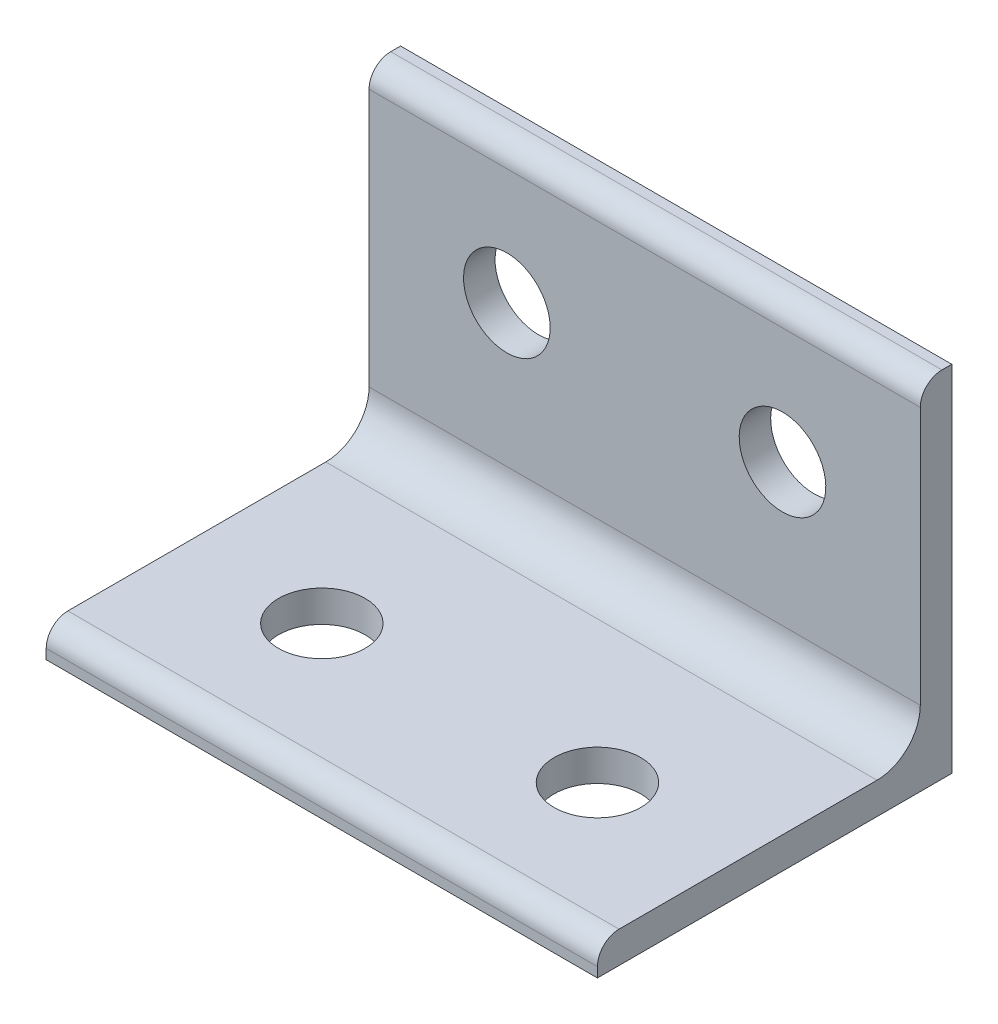
ISO-10303-21;
HEADER;
FILE_DESCRIPTION(('STEP AP214'),'2;1');
FILE_NAME('part.step','',(''),(''),'','','');
FILE_SCHEMA(('AUTOMOTIVE_DESIGN { 1 0 10303 214 1 1 1 1 }'));
ENDSEC;
DATA;
#1=APPLICATION_CONTEXT('core data for automotive mechanical design processes');
#2=APPLICATION_PROTOCOL_DEFINITION('international standard','automotive_design',2000,#1);
#3=PRODUCT_CONTEXT('',#1,'mechanical');
#4=PRODUCT('Part','Part','',(#3));
#5=PRODUCT_RELATED_PRODUCT_CATEGORY('part','',(#4));
#6=PRODUCT_DEFINITION_FORMATION('','',#4);
#7=PRODUCT_DEFINITION_CONTEXT('part definition',#1,'design');
#8=PRODUCT_DEFINITION('design','',#6,#7);
#9=PRODUCT_DEFINITION_SHAPE('','',#8);
#10=(LENGTH_UNIT() NAMED_UNIT(*) SI_UNIT(.MILLI.,.METRE.));
#11=(NAMED_UNIT(*) PLANE_ANGLE_UNIT() SI_UNIT($,.RADIAN.));
#12=(NAMED_UNIT(*) SI_UNIT($,.STERADIAN.) SOLID_ANGLE_UNIT());
#13=UNCERTAINTY_MEASURE_WITH_UNIT(LENGTH_MEASURE(1.E-05),#10,'distance_accuracy_value','');
#14=(GEOMETRIC_REPRESENTATION_CONTEXT(3) GLOBAL_UNCERTAINTY_ASSIGNED_CONTEXT((#13)) GLOBAL_UNIT_ASSIGNED_CONTEXT((#10,
#11,#12)) REPRESENTATION_CONTEXT('',''));
#15=CARTESIAN_POINT('',(0.,0.,0.));
#16=DIRECTION('',(0.,0.,1.));
#17=DIRECTION('',(1.,0.,0.));
#18=AXIS2_PLACEMENT_3D('',#15,#16,#17);
#19=CARTESIAN_POINT('',(140.,0.,0.));
#20=DIRECTION('',(0.,0.,1.));
#21=DIRECTION('',(1.,0.,0.));
#22=AXIS2_PLACEMENT_3D('',#19,#20,#21);
#23=PLANE('',#22);
#24=CARTESIAN_POINT('',(35.,55.,0.));
#25=DIRECTION('',(0.,0.,1.));
#26=DIRECTION('',(1.,0.,0.));
#27=AXIS2_PLACEMENT_3D('',#24,#25,#26);
#28=CIRCLE('',#27,11.);
#29=CARTESIAN_POINT('',(35.,44.,0.));
#30=VERTEX_POINT('',#29);
#31=EDGE_CURVE('E214',#30,#30,#28,.F.);
#32=ORIENTED_EDGE('',*,*,#31,.F.);
#33=EDGE_LOOP('',(#32));
#34=FACE_BOUND('',#33,.T.);
#35=CARTESIAN_POINT('',(105.,55.,0.));
#36=DIRECTION('',(0.,0.,1.));
#37=DIRECTION('',(1.,0.,0.));
#38=AXIS2_PLACEMENT_3D('',#35,#36,#37);
#39=CIRCLE('',#38,11.);
#40=CARTESIAN_POINT('',(105.,44.,0.));
#41=VERTEX_POINT('',#40);
#42=EDGE_CURVE('E217',#41,#41,#39,.F.);
#43=ORIENTED_EDGE('',*,*,#42,.F.);
#44=EDGE_LOOP('',(#43));
#45=FACE_BOUND('',#44,.T.);
#46=DIRECTION('',(0.,1.,0.));
#47=VECTOR('',#46,1.);
#48=CARTESIAN_POINT('',(0.,0.,0.));
#49=LINE('',#48,#47);
#50=CARTESIAN_POINT('',(0.,0.,0.));
#51=VERTEX_POINT('',#50);
#52=CARTESIAN_POINT('',(0.,90.,0.));
#53=VERTEX_POINT('',#52);
#54=EDGE_CURVE('E176',#51,#53,#49,.T.);
#55=ORIENTED_EDGE('',*,*,#54,.T.);
#56=DIRECTION('',(-1.,0.,0.));
#57=VECTOR('',#56,1.);
#58=CARTESIAN_POINT('',(140.,90.,0.));
#59=LINE('',#58,#57);
#60=CARTESIAN_POINT('',(140.,90.,0.));
#61=VERTEX_POINT('',#60);
#62=EDGE_CURVE('E13',#61,#53,#59,.T.);
#63=ORIENTED_EDGE('',*,*,#62,.F.);
#64=DIRECTION('',(0.,1.,0.));
#65=VECTOR('',#64,1.);
#66=CARTESIAN_POINT('',(140.,0.,0.));
#67=LINE('',#66,#65);
#68=CARTESIAN_POINT('',(140.,0.,0.));
#69=VERTEX_POINT('',#68);
#70=EDGE_CURVE('E193',#69,#61,#67,.T.);
#71=ORIENTED_EDGE('',*,*,#70,.F.);
#72=DIRECTION('',(-1.,0.,0.));
#73=VECTOR('',#72,1.);
#74=CARTESIAN_POINT('',(140.,0.,0.));
#75=LINE('',#74,#73);
#76=EDGE_CURVE('E172',#69,#51,#75,.T.);
#77=ORIENTED_EDGE('',*,*,#76,.T.);
#78=EDGE_LOOP('',(#55,#63,#71,#77));
#79=FACE_BOUND('',#78,.T.);
#80=ADVANCED_FACE('F72',(#34,#45,#79),#23,.F.);
#81=CARTESIAN_POINT('',(140.,90.,0.));
#82=DIRECTION('',(0.,-1.,0.));
#83=DIRECTION('',(0.,0.,-1.));
#84=AXIS2_PLACEMENT_3D('',#81,#82,#83);
#85=PLANE('',#84);
#86=DIRECTION('',(0.,0.,1.));
#87=VECTOR('',#86,1.);
#88=CARTESIAN_POINT('',(0.,90.,0.));
#89=LINE('',#88,#87);
#90=CARTESIAN_POINT('',(0.,90.,2.5));
#91=VERTEX_POINT('',#90);
#92=EDGE_CURVE('E179',#53,#91,#89,.T.);
#93=ORIENTED_EDGE('',*,*,#92,.T.);
#94=DIRECTION('',(-1.,0.,0.));
#95=VECTOR('',#94,1.);
#96=CARTESIAN_POINT('',(140.,90.,2.5));
#97=LINE('',#96,#95);
#98=CARTESIAN_POINT('',(140.,90.,2.5));
#99=VERTEX_POINT('',#98);
#100=EDGE_CURVE('E81',#99,#91,#97,.T.);
#101=ORIENTED_EDGE('',*,*,#100,.F.);
#102=DIRECTION('',(0.,0.,1.));
#103=VECTOR('',#102,1.);
#104=CARTESIAN_POINT('',(140.,90.,0.));
#105=LINE('',#104,#103);
#106=EDGE_CURVE('E136',#61,#99,#105,.T.);
#107=ORIENTED_EDGE('',*,*,#106,.F.);
#108=ORIENTED_EDGE('',*,*,#62,.T.);
#109=EDGE_LOOP('',(#93,#101,#107,#108));
#110=FACE_BOUND('',#109,.T.);
#111=ADVANCED_FACE('F272',(#110),#85,.F.);
#112=CARTESIAN_POINT('',(140.,84.5,2.5));
#113=DIRECTION('',(-1.,0.,0.));
#114=DIRECTION('',(0.,0.,1.));
#115=AXIS2_PLACEMENT_3D('',#112,#113,#114);
#116=CYLINDRICAL_SURFACE('',#115,5.5);
#117=CARTESIAN_POINT('',(0.,84.5,2.5));
#118=DIRECTION('',(1.,0.,0.));
#119=DIRECTION('',(0.,0.,-1.));
#120=AXIS2_PLACEMENT_3D('',#117,#118,#119);
#121=CIRCLE('',#120,5.5);
#122=CARTESIAN_POINT('',(0.,84.5,8.00000000000001));
#123=VERTEX_POINT('',#122);
#124=EDGE_CURVE('E182',#91,#123,#121,.T.);
#125=ORIENTED_EDGE('',*,*,#124,.T.);
#126=DIRECTION('',(-1.,0.,0.));
#127=VECTOR('',#126,1.);
#128=CARTESIAN_POINT('',(140.,84.5,8.00000000000001));
#129=LINE('',#128,#127);
#130=CARTESIAN_POINT('',(140.,84.5,8.00000000000001));
#131=VERTEX_POINT('',#130);
#132=EDGE_CURVE('E203',#131,#123,#129,.T.);
#133=ORIENTED_EDGE('',*,*,#132,.F.);
#134=CARTESIAN_POINT('',(140.,84.5,2.5));
#135=DIRECTION('',(1.,0.,0.));
#136=DIRECTION('',(0.,0.,-1.));
#137=AXIS2_PLACEMENT_3D('',#134,#135,#136);
#138=CIRCLE('',#137,5.5);
#139=EDGE_CURVE('E234',#99,#131,#138,.T.);
#140=ORIENTED_EDGE('',*,*,#139,.F.);
#141=ORIENTED_EDGE('',*,*,#100,.T.);
#142=EDGE_LOOP('',(#125,#133,#140,#141));
#143=FACE_BOUND('',#142,.T.);
#144=ADVANCED_FACE('F278',(#143),#116,.T.);
#145=CARTESIAN_POINT('',(140.,84.5,8.00000000000001));
#146=DIRECTION('',(0.,0.,-1.));
#147=DIRECTION('',(0.,1.,0.));
#148=AXIS2_PLACEMENT_3D('',#145,#146,#147);
#149=PLANE('',#148);
#150=CARTESIAN_POINT('',(35.,55.,7.99999999999999));
#151=DIRECTION('',(0.,0.,-1.));
#152=DIRECTION('',(0.,1.,0.));
#153=AXIS2_PLACEMENT_3D('',#150,#151,#152);
#154=CIRCLE('',#153,11.);
#155=CARTESIAN_POINT('',(35.,44.,7.99999999999999));
#156=VERTEX_POINT('',#155);
#157=EDGE_CURVE('E75',#156,#156,#154,.F.);
#158=ORIENTED_EDGE('',*,*,#157,.F.);
#159=EDGE_LOOP('',(#158));
#160=FACE_BOUND('',#159,.T.);
#161=CARTESIAN_POINT('',(105.,55.,7.99999999999999));
#162=DIRECTION('',(0.,0.,-1.));
#163=DIRECTION('',(0.,1.,0.));
#164=AXIS2_PLACEMENT_3D('',#161,#162,#163);
#165=CIRCLE('',#164,11.);
#166=CARTESIAN_POINT('',(105.,44.,7.99999999999999));
#167=VERTEX_POINT('',#166);
#168=EDGE_CURVE('E215',#167,#167,#165,.F.);
#169=ORIENTED_EDGE('',*,*,#168,.F.);
#170=EDGE_LOOP('',(#169));
#171=FACE_BOUND('',#170,.T.);
#172=DIRECTION('',(0.,-1.,0.));
#173=VECTOR('',#172,1.);
#174=CARTESIAN_POINT('',(0.,84.5,8.00000000000001));
#175=LINE('',#174,#173);
#176=CARTESIAN_POINT('',(0.,19.,7.99999999999998));
#177=VERTEX_POINT('',#176);
#178=EDGE_CURVE('E184',#123,#177,#175,.T.);
#179=ORIENTED_EDGE('',*,*,#178,.T.);
#180=DIRECTION('',(-1.,0.,0.));
#181=VECTOR('',#180,1.);
#182=CARTESIAN_POINT('',(140.,19.,7.99999999999998));
#183=LINE('',#182,#181);
#184=CARTESIAN_POINT('',(140.,19.,7.99999999999998));
#185=VERTEX_POINT('',#184);
#186=EDGE_CURVE('E200',#185,#177,#183,.T.);
#187=ORIENTED_EDGE('',*,*,#186,.F.);
#188=DIRECTION('',(0.,-1.,0.));
#189=VECTOR('',#188,1.);
#190=CARTESIAN_POINT('',(140.,84.5,8.00000000000001));
#191=LINE('',#190,#189);
#192=EDGE_CURVE('E236',#131,#185,#191,.T.);
#193=ORIENTED_EDGE('',*,*,#192,.F.);
#194=ORIENTED_EDGE('',*,*,#132,.T.);
#195=EDGE_LOOP('',(#179,#187,#193,#194));
#196=FACE_BOUND('',#195,.T.);
#197=ADVANCED_FACE('F373',(#160,#171,#196),#149,.F.);
#198=CARTESIAN_POINT('',(140.,19.,19.));
#199=DIRECTION('',(-1.,0.,0.));
#200=DIRECTION('',(0.,0.,1.));
#201=AXIS2_PLACEMENT_3D('',#198,#199,#200);
#202=CYLINDRICAL_SURFACE('',#201,11.);
#203=CARTESIAN_POINT('',(0.,19.,19.));
#204=DIRECTION('',(-1.,0.,0.));
#205=DIRECTION('',(0.,0.,1.));
#206=AXIS2_PLACEMENT_3D('',#203,#204,#205);
#207=CIRCLE('',#206,11.);
#208=CARTESIAN_POINT('',(0.,7.99999999999999,19.));
#209=VERTEX_POINT('',#208);
#210=EDGE_CURVE('E186',#177,#209,#207,.T.);
#211=ORIENTED_EDGE('',*,*,#210,.T.);
#212=DIRECTION('',(-1.,0.,0.));
#213=VECTOR('',#212,1.);
#214=CARTESIAN_POINT('',(140.,7.99999999999999,19.));
#215=LINE('',#214,#213);
#216=CARTESIAN_POINT('',(140.,7.99999999999999,19.));
#217=VERTEX_POINT('',#216);
#218=EDGE_CURVE('E197',#217,#209,#215,.T.);
#219=ORIENTED_EDGE('',*,*,#218,.F.);
#220=CARTESIAN_POINT('',(140.,19.,19.));
#221=DIRECTION('',(-1.,0.,0.));
#222=DIRECTION('',(0.,0.,1.));
#223=AXIS2_PLACEMENT_3D('',#220,#221,#222);
#224=CIRCLE('',#223,11.);
#225=EDGE_CURVE('E238',#185,#217,#224,.T.);
#226=ORIENTED_EDGE('',*,*,#225,.F.);
#227=ORIENTED_EDGE('',*,*,#186,.T.);
#228=EDGE_LOOP('',(#211,#219,#226,#227));
#229=FACE_BOUND('',#228,.T.);
#230=ADVANCED_FACE('F244',(#229),#202,.F.);
#231=CARTESIAN_POINT('',(140.,7.99999999999999,19.));
#232=DIRECTION('',(0.,-1.,0.));
#233=DIRECTION('',(0.,0.,-1.));
#234=AXIS2_PLACEMENT_3D('',#231,#232,#233);
#235=PLANE('',#234);
#236=CARTESIAN_POINT('',(105.,8.00000000000001,55.));
#237=DIRECTION('',(0.,-1.,0.));
#238=DIRECTION('',(0.,0.,-1.));
#239=AXIS2_PLACEMENT_3D('',#236,#237,#238);
#240=CIRCLE('',#239,11.);
#241=CARTESIAN_POINT('',(105.,7.99999999999999,44.));
#242=VERTEX_POINT('',#241);
#243=EDGE_CURVE('E211',#242,#242,#240,.F.);
#244=ORIENTED_EDGE('',*,*,#243,.F.);
#245=EDGE_LOOP('',(#244));
#246=FACE_BOUND('',#245,.T.);
#247=CARTESIAN_POINT('',(35.,8.00000000000001,55.));
#248=DIRECTION('',(0.,-1.,0.));
#249=DIRECTION('',(0.,0.,-1.));
#250=AXIS2_PLACEMENT_3D('',#247,#248,#249);
#251=CIRCLE('',#250,11.);
#252=CARTESIAN_POINT('',(35.,7.99999999999999,44.));
#253=VERTEX_POINT('',#252);
#254=EDGE_CURVE('E180',#253,#253,#251,.F.);
#255=ORIENTED_EDGE('',*,*,#254,.F.);
#256=EDGE_LOOP('',(#255));
#257=FACE_BOUND('',#256,.T.);
#258=DIRECTION('',(0.,0.,1.));
#259=VECTOR('',#258,1.);
#260=CARTESIAN_POINT('',(0.,7.99999999999999,19.));
#261=LINE('',#260,#259);
#262=CARTESIAN_POINT('',(0.,8.00000000000001,84.5));
#263=VERTEX_POINT('',#262);
#264=EDGE_CURVE('E188',#209,#263,#261,.T.);
#265=ORIENTED_EDGE('',*,*,#264,.T.);
#266=DIRECTION('',(-1.,0.,0.));
#267=VECTOR('',#266,1.);
#268=CARTESIAN_POINT('',(140.,8.00000000000001,84.5));
#269=LINE('',#268,#267);
#270=CARTESIAN_POINT('',(140.,8.00000000000001,84.5));
#271=VERTEX_POINT('',#270);
#272=EDGE_CURVE('E167',#271,#263,#269,.T.);
#273=ORIENTED_EDGE('',*,*,#272,.F.);
#274=DIRECTION('',(0.,0.,1.));
#275=VECTOR('',#274,1.);
#276=CARTESIAN_POINT('',(140.,7.99999999999999,19.));
#277=LINE('',#276,#275);
#278=EDGE_CURVE('E158',#217,#271,#277,.T.);
#279=ORIENTED_EDGE('',*,*,#278,.F.);
#280=ORIENTED_EDGE('',*,*,#218,.T.);
#281=EDGE_LOOP('',(#265,#273,#279,#280));
#282=FACE_BOUND('',#281,.T.);
#283=ADVANCED_FACE('F248',(#246,#257,#282),#235,.F.);
#284=CARTESIAN_POINT('',(140.,2.5,84.5));
#285=DIRECTION('',(-1.,0.,0.));
#286=DIRECTION('',(0.,0.,1.));
#287=AXIS2_PLACEMENT_3D('',#284,#285,#286);
#288=CYLINDRICAL_SURFACE('',#287,5.5);
#289=CARTESIAN_POINT('',(0.,2.5,84.5));
#290=DIRECTION('',(1.,0.,0.));
#291=DIRECTION('',(0.,0.,-1.));
#292=AXIS2_PLACEMENT_3D('',#289,#290,#291);
#293=CIRCLE('',#292,5.5);
#294=CARTESIAN_POINT('',(0.,2.5,90.));
#295=VERTEX_POINT('',#294);
#296=EDGE_CURVE('E166',#263,#295,#293,.T.);
#297=ORIENTED_EDGE('',*,*,#296,.T.);
#298=DIRECTION('',(-1.,0.,0.));
#299=VECTOR('',#298,1.);
#300=CARTESIAN_POINT('',(140.,2.5,90.));
#301=LINE('',#300,#299);
#302=CARTESIAN_POINT('',(140.,2.5,90.));
#303=VERTEX_POINT('',#302);
#304=EDGE_CURVE('E163',#303,#295,#301,.T.);
#305=ORIENTED_EDGE('',*,*,#304,.F.);
#306=CARTESIAN_POINT('',(140.,2.5,84.5));
#307=DIRECTION('',(1.,0.,0.));
#308=DIRECTION('',(0.,0.,-1.));
#309=AXIS2_PLACEMENT_3D('',#306,#307,#308);
#310=CIRCLE('',#309,5.5);
#311=EDGE_CURVE('E152',#271,#303,#310,.T.);
#312=ORIENTED_EDGE('',*,*,#311,.F.);
#313=ORIENTED_EDGE('',*,*,#272,.T.);
#314=EDGE_LOOP('',(#297,#305,#312,#313));
#315=FACE_BOUND('',#314,.T.);
#316=ADVANCED_FACE('F164',(#315),#288,.T.);
#317=CARTESIAN_POINT('',(140.,2.5,90.));
#318=DIRECTION('',(0.,0.,-1.));
#319=DIRECTION('',(0.,1.,0.));
#320=AXIS2_PLACEMENT_3D('',#317,#318,#319);
#321=PLANE('',#320);
#322=DIRECTION('',(0.,-1.,0.));
#323=VECTOR('',#322,1.);
#324=CARTESIAN_POINT('',(0.,2.5,90.));
#325=LINE('',#324,#323);
#326=CARTESIAN_POINT('',(0.,0.,90.));
#327=VERTEX_POINT('',#326);
#328=EDGE_CURVE('E122',#295,#327,#325,.T.);
#329=ORIENTED_EDGE('',*,*,#328,.T.);
#330=DIRECTION('',(-1.,0.,0.));
#331=VECTOR('',#330,1.);
#332=CARTESIAN_POINT('',(140.,0.,90.));
#333=LINE('',#332,#331);
#334=CARTESIAN_POINT('',(140.,0.,90.));
#335=VERTEX_POINT('',#334);
#336=EDGE_CURVE('E168',#335,#327,#333,.T.);
#337=ORIENTED_EDGE('',*,*,#336,.F.);
#338=DIRECTION('',(0.,-1.,0.));
#339=VECTOR('',#338,1.);
#340=CARTESIAN_POINT('',(140.,2.5,90.));
#341=LINE('',#340,#339);
#342=EDGE_CURVE('E156',#303,#335,#341,.T.);
#343=ORIENTED_EDGE('',*,*,#342,.F.);
#344=ORIENTED_EDGE('',*,*,#304,.T.);
#345=EDGE_LOOP('',(#329,#337,#343,#344));
#346=FACE_BOUND('',#345,.T.);
#347=ADVANCED_FACE('F170',(#346),#321,.F.);
#348=CARTESIAN_POINT('',(140.,0.,90.));
#349=DIRECTION('',(0.,1.,0.));
#350=DIRECTION('',(0.,0.,1.));
#351=AXIS2_PLACEMENT_3D('',#348,#349,#350);
#352=PLANE('',#351);
#353=CARTESIAN_POINT('',(105.,0.,55.));
#354=DIRECTION('',(0.,1.,0.));
#355=DIRECTION('',(0.,0.,1.));
#356=AXIS2_PLACEMENT_3D('',#353,#354,#355);
#357=CIRCLE('',#356,11.);
#358=CARTESIAN_POINT('',(105.,0.,44.));
#359=VERTEX_POINT('',#358);
#360=EDGE_CURVE('E212',#359,#359,#357,.F.);
#361=ORIENTED_EDGE('',*,*,#360,.F.);
#362=EDGE_LOOP('',(#361));
#363=FACE_BOUND('',#362,.T.);
#364=CARTESIAN_POINT('',(35.,0.,55.));
#365=DIRECTION('',(0.,1.,0.));
#366=DIRECTION('',(0.,0.,1.));
#367=AXIS2_PLACEMENT_3D('',#364,#365,#366);
#368=CIRCLE('',#367,11.);
#369=CARTESIAN_POINT('',(35.,0.,44.));
#370=VERTEX_POINT('',#369);
#371=EDGE_CURVE('E208',#370,#370,#368,.F.);
#372=ORIENTED_EDGE('',*,*,#371,.F.);
#373=EDGE_LOOP('',(#372));
#374=FACE_BOUND('',#373,.T.);
#375=DIRECTION('',(0.,0.,-1.));
#376=VECTOR('',#375,1.);
#377=CARTESIAN_POINT('',(0.,0.,90.));
#378=LINE('',#377,#376);
#379=EDGE_CURVE('E128',#327,#51,#378,.T.);
#380=ORIENTED_EDGE('',*,*,#379,.T.);
#381=ORIENTED_EDGE('',*,*,#76,.F.);
#382=DIRECTION('',(0.,0.,-1.));
#383=VECTOR('',#382,1.);
#384=CARTESIAN_POINT('',(140.,0.,90.));
#385=LINE('',#384,#383);
#386=EDGE_CURVE('E90',#335,#69,#385,.T.);
#387=ORIENTED_EDGE('',*,*,#386,.F.);
#388=ORIENTED_EDGE('',*,*,#336,.T.);
#389=EDGE_LOOP('',(#380,#381,#387,#388));
#390=FACE_BOUND('',#389,.T.);
#391=ADVANCED_FACE('F256',(#363,#374,#390),#352,.F.);
#392=CARTESIAN_POINT('',(140.,84.5,2.5));
#393=DIRECTION('',(1.,0.,0.));
#394=DIRECTION('',(0.,0.,-1.));
#395=AXIS2_PLACEMENT_3D('',#392,#393,#394);
#396=PLANE('',#395);
#397=ORIENTED_EDGE('',*,*,#70,.T.);
#398=ORIENTED_EDGE('',*,*,#106,.T.);
#399=ORIENTED_EDGE('',*,*,#139,.T.);
#400=ORIENTED_EDGE('',*,*,#192,.T.);
#401=ORIENTED_EDGE('',*,*,#225,.T.);
#402=ORIENTED_EDGE('',*,*,#278,.T.);
#403=ORIENTED_EDGE('',*,*,#311,.T.);
#404=ORIENTED_EDGE('',*,*,#342,.T.);
#405=ORIENTED_EDGE('',*,*,#386,.T.);
#406=EDGE_LOOP('',(#397,#398,#399,#400,#401,#402,#403,#404,#405));
#407=FACE_BOUND('',#406,.T.);
#408=ADVANCED_FACE('F154',(#407),#396,.T.);
#409=CARTESIAN_POINT('',(0.,84.5,2.5));
#410=DIRECTION('',(1.,0.,0.));
#411=DIRECTION('',(0.,0.,-1.));
#412=AXIS2_PLACEMENT_3D('',#409,#410,#411);
#413=PLANE('',#412);
#414=ORIENTED_EDGE('',*,*,#54,.F.);
#415=ORIENTED_EDGE('',*,*,#379,.F.);
#416=ORIENTED_EDGE('',*,*,#328,.F.);
#417=ORIENTED_EDGE('',*,*,#296,.F.);
#418=ORIENTED_EDGE('',*,*,#264,.F.);
#419=ORIENTED_EDGE('',*,*,#210,.F.);
#420=ORIENTED_EDGE('',*,*,#178,.F.);
#421=ORIENTED_EDGE('',*,*,#124,.F.);
#422=ORIENTED_EDGE('',*,*,#92,.F.);
#423=EDGE_LOOP('',(#414,#415,#416,#417,#418,#419,#420,#421,#422));
#424=FACE_BOUND('',#423,.T.);
#425=ADVANCED_FACE('F251',(#424),#413,.F.);
#426=CARTESIAN_POINT('',(35.,90.,55.));
#427=DIRECTION('',(0.,-1.,0.));
#428=DIRECTION('',(0.,0.,-1.));
#429=AXIS2_PLACEMENT_3D('',#426,#427,#428);
#430=CYLINDRICAL_SURFACE('',#429,11.);
#431=CARTESIAN_POINT('',(35.,0.,44.));
#432=CARTESIAN_POINT('',(35.,0.0833333333333194,44.));
#433=CARTESIAN_POINT('',(35.,0.166666666666653,44.));
#434=CARTESIAN_POINT('',(35.,0.33333333333332,44.));
#435=CARTESIAN_POINT('',(35.,0.416666666666653,44.));
#436=CARTESIAN_POINT('',(35.,0.58333333333332,44.));
#437=CARTESIAN_POINT('',(35.,0.666666666666653,44.));
#438=CARTESIAN_POINT('',(35.,0.83333333333332,44.));
#439=CARTESIAN_POINT('',(35.,0.916666666666654,44.));
#440=CARTESIAN_POINT('',(35.,1.08333333333332,44.));
#441=CARTESIAN_POINT('',(35.,1.16666666666665,44.));
#442=CARTESIAN_POINT('',(35.,1.33333333333332,44.));
#443=CARTESIAN_POINT('',(35.,1.41666666666665,44.));
#444=CARTESIAN_POINT('',(35.,1.58333333333332,44.));
#445=CARTESIAN_POINT('',(35.,1.66666666666665,44.));
#446=CARTESIAN_POINT('',(35.,1.83333333333332,44.));
#447=CARTESIAN_POINT('',(35.,1.91666666666665,44.));
#448=CARTESIAN_POINT('',(35.,2.08333333333332,44.));
#449=CARTESIAN_POINT('',(35.,2.16666666666665,44.));
#450=CARTESIAN_POINT('',(35.,2.33333333333332,44.));
#451=CARTESIAN_POINT('',(35.,2.41666666666665,44.));
#452=CARTESIAN_POINT('',(35.,2.58333333333332,44.));
#453=CARTESIAN_POINT('',(35.,2.66666666666666,44.));
#454=CARTESIAN_POINT('',(35.,2.83333333333332,44.));
#455=CARTESIAN_POINT('',(35.,2.91666666666666,44.));
#456=CARTESIAN_POINT('',(35.,3.08333333333332,44.));
#457=CARTESIAN_POINT('',(35.,3.16666666666666,44.));
#458=CARTESIAN_POINT('',(35.,3.33333333333332,44.));
#459=CARTESIAN_POINT('',(35.,3.41666666666666,44.));
#460=CARTESIAN_POINT('',(35.,3.58333333333332,44.));
#461=CARTESIAN_POINT('',(35.,3.66666666666666,44.));
#462=CARTESIAN_POINT('',(35.,3.83333333333332,44.));
#463=CARTESIAN_POINT('',(35.,3.91666666666666,44.));
#464=CARTESIAN_POINT('',(35.,4.08333333333332,44.));
#465=CARTESIAN_POINT('',(35.,4.16666666666666,44.));
#466=CARTESIAN_POINT('',(35.,4.33333333333332,44.));
#467=CARTESIAN_POINT('',(35.,4.41666666666666,44.));
#468=CARTESIAN_POINT('',(35.,4.58333333333332,44.));
#469=CARTESIAN_POINT('',(35.,4.66666666666666,44.));
#470=CARTESIAN_POINT('',(35.,4.83333333333332,44.));
#471=CARTESIAN_POINT('',(35.,4.91666666666666,44.));
#472=CARTESIAN_POINT('',(35.,5.08333333333332,44.));
#473=CARTESIAN_POINT('',(35.,5.16666666666666,44.));
#474=CARTESIAN_POINT('',(35.,5.33333333333332,44.));
#475=CARTESIAN_POINT('',(35.,5.41666666666666,44.));
#476=CARTESIAN_POINT('',(35.,5.58333333333333,44.));
#477=CARTESIAN_POINT('',(35.,5.66666666666666,44.));
#478=CARTESIAN_POINT('',(35.,5.83333333333333,44.));
#479=CARTESIAN_POINT('',(35.,5.91666666666666,44.));
#480=CARTESIAN_POINT('',(35.,6.08333333333333,44.));
#481=CARTESIAN_POINT('',(35.,6.16666666666666,44.));
#482=CARTESIAN_POINT('',(35.,6.33333333333333,44.));
#483=CARTESIAN_POINT('',(35.,6.41666666666666,44.));
#484=CARTESIAN_POINT('',(35.,6.58333333333333,44.));
#485=CARTESIAN_POINT('',(35.,6.66666666666666,44.));
#486=CARTESIAN_POINT('',(35.,6.83333333333333,44.));
#487=CARTESIAN_POINT('',(35.,6.91666666666666,44.));
#488=CARTESIAN_POINT('',(35.,7.08333333333333,44.));
#489=CARTESIAN_POINT('',(35.,7.16666666666666,44.));
#490=CARTESIAN_POINT('',(35.,7.33333333333333,44.));
#491=CARTESIAN_POINT('',(35.,7.41666666666666,44.));
#492=CARTESIAN_POINT('',(35.,7.58333333333333,44.));
#493=CARTESIAN_POINT('',(35.,7.66666666666666,44.));
#494=CARTESIAN_POINT('',(35.,7.83333333333333,44.));
#495=CARTESIAN_POINT('',(35.,7.91666666666666,44.));
#496=CARTESIAN_POINT('',(35.,7.99999999999999,44.));
#497=B_SPLINE_CURVE_WITH_KNOTS('',3,(#431,#432,#433,#434,#435,#436,#437,#438,#439,#440,#441,
#442,#443,#444,#445,#446,#447,#448,#449,#450,#451,#452,#453,#454,#455,#456,#457,#458,#459,#460,
#461,#462,#463,#464,#465,#466,#467,#468,#469,#470,#471,#472,#473,#474,#475,#476,#477,#478,#479,
#480,#481,#482,#483,#484,#485,#486,#487,#488,#489,#490,#491,#492,#493,#494,#495,#496),
.UNSPECIFIED.,.F.,.F.,(4,2,2,2,2,2,2,2,2,2,2,2,2,2,2,2,2,2,2,2,2,2,2,2,2,2,2,2,2,2,2,2,4),(0.,
0.25,0.5,0.750000000000001,1.,1.25,1.5,1.75,2.,2.25,2.5,2.75,3.,3.25,3.5,3.75,4.,4.25,4.5,4.75,
5.,5.25,5.50000000000001,5.75000000000001,6.00000000000001,6.25000000000001,6.50000000000001,
6.75000000000001,7.00000000000001,7.25000000000001,7.50000000000001,7.75000000000001,
8.00000000000001),.UNSPECIFIED.);
#498=EDGE_CURVE('BSEAM294',#370,#253,#497,.T.);
#499=ORIENTED_EDGE('',*,*,#371,.T.);
#500=ORIENTED_EDGE('',*,*,#254,.T.);
#501=ORIENTED_EDGE('',*,*,#498,.T.);
#502=ORIENTED_EDGE('',*,*,#498,.F.);
#503=EDGE_LOOP('',(#499,#501,#500,#502));
#504=FACE_BOUND('',#503,.T.);
#505=ADVANCED_FACE('F294',(#504),#430,.F.);
#506=CARTESIAN_POINT('',(105.,90.,55.));
#507=DIRECTION('',(0.,-1.,0.));
#508=DIRECTION('',(0.,0.,-1.));
#509=AXIS2_PLACEMENT_3D('',#506,#507,#508);
#510=CYLINDRICAL_SURFACE('',#509,11.);
#511=CARTESIAN_POINT('',(105.,0.,44.));
#512=CARTESIAN_POINT('',(105.,0.0833333333333194,44.));
#513=CARTESIAN_POINT('',(105.,0.166666666666653,44.));
#514=CARTESIAN_POINT('',(105.,0.33333333333332,44.));
#515=CARTESIAN_POINT('',(105.,0.416666666666653,44.));
#516=CARTESIAN_POINT('',(105.,0.58333333333332,44.));
#517=CARTESIAN_POINT('',(105.,0.666666666666653,44.));
#518=CARTESIAN_POINT('',(105.,0.83333333333332,44.));
#519=CARTESIAN_POINT('',(105.,0.916666666666654,44.));
#520=CARTESIAN_POINT('',(105.,1.08333333333332,44.));
#521=CARTESIAN_POINT('',(105.,1.16666666666665,44.));
#522=CARTESIAN_POINT('',(105.,1.33333333333332,44.));
#523=CARTESIAN_POINT('',(105.,1.41666666666665,44.));
#524=CARTESIAN_POINT('',(105.,1.58333333333332,44.));
#525=CARTESIAN_POINT('',(105.,1.66666666666665,44.));
#526=CARTESIAN_POINT('',(105.,1.83333333333332,44.));
#527=CARTESIAN_POINT('',(105.,1.91666666666665,44.));
#528=CARTESIAN_POINT('',(105.,2.08333333333332,44.));
#529=CARTESIAN_POINT('',(105.,2.16666666666665,44.));
#530=CARTESIAN_POINT('',(105.,2.33333333333332,44.));
#531=CARTESIAN_POINT('',(105.,2.41666666666665,44.));
#532=CARTESIAN_POINT('',(105.,2.58333333333332,44.));
#533=CARTESIAN_POINT('',(105.,2.66666666666666,44.));
#534=CARTESIAN_POINT('',(105.,2.83333333333332,44.));
#535=CARTESIAN_POINT('',(105.,2.91666666666666,44.));
#536=CARTESIAN_POINT('',(105.,3.08333333333332,44.));
#537=CARTESIAN_POINT('',(105.,3.16666666666666,44.));
#538=CARTESIAN_POINT('',(105.,3.33333333333332,44.));
#539=CARTESIAN_POINT('',(105.,3.41666666666666,44.));
#540=CARTESIAN_POINT('',(105.,3.58333333333332,44.));
#541=CARTESIAN_POINT('',(105.,3.66666666666666,44.));
#542=CARTESIAN_POINT('',(105.,3.83333333333332,44.));
#543=CARTESIAN_POINT('',(105.,3.91666666666666,44.));
#544=CARTESIAN_POINT('',(105.,4.08333333333332,44.));
#545=CARTESIAN_POINT('',(105.,4.16666666666666,44.));
#546=CARTESIAN_POINT('',(105.,4.33333333333332,44.));
#547=CARTESIAN_POINT('',(105.,4.41666666666666,44.));
#548=CARTESIAN_POINT('',(105.,4.58333333333332,44.));
#549=CARTESIAN_POINT('',(105.,4.66666666666666,44.));
#550=CARTESIAN_POINT('',(105.,4.83333333333332,44.));
#551=CARTESIAN_POINT('',(105.,4.91666666666666,44.));
#552=CARTESIAN_POINT('',(105.,5.08333333333332,44.));
#553=CARTESIAN_POINT('',(105.,5.16666666666666,44.));
#554=CARTESIAN_POINT('',(105.,5.33333333333332,44.));
#555=CARTESIAN_POINT('',(105.,5.41666666666666,44.));
#556=CARTESIAN_POINT('',(105.,5.58333333333333,44.));
#557=CARTESIAN_POINT('',(105.,5.66666666666666,44.));
#558=CARTESIAN_POINT('',(105.,5.83333333333333,44.));
#559=CARTESIAN_POINT('',(105.,5.91666666666666,44.));
#560=CARTESIAN_POINT('',(105.,6.08333333333333,44.));
#561=CARTESIAN_POINT('',(105.,6.16666666666666,44.));
#562=CARTESIAN_POINT('',(105.,6.33333333333333,44.));
#563=CARTESIAN_POINT('',(105.,6.41666666666666,44.));
#564=CARTESIAN_POINT('',(105.,6.58333333333333,44.));
#565=CARTESIAN_POINT('',(105.,6.66666666666666,44.));
#566=CARTESIAN_POINT('',(105.,6.83333333333333,44.));
#567=CARTESIAN_POINT('',(105.,6.91666666666666,44.));
#568=CARTESIAN_POINT('',(105.,7.08333333333333,44.));
#569=CARTESIAN_POINT('',(105.,7.16666666666666,44.));
#570=CARTESIAN_POINT('',(105.,7.33333333333333,44.));
#571=CARTESIAN_POINT('',(105.,7.41666666666666,44.));
#572=CARTESIAN_POINT('',(105.,7.58333333333333,44.));
#573=CARTESIAN_POINT('',(105.,7.66666666666666,44.));
#574=CARTESIAN_POINT('',(105.,7.83333333333333,44.));
#575=CARTESIAN_POINT('',(105.,7.91666666666666,44.));
#576=CARTESIAN_POINT('',(105.,7.99999999999999,44.));
#577=B_SPLINE_CURVE_WITH_KNOTS('',3,(#511,#512,#513,#514,#515,#516,#517,#518,#519,#520,#521,
#522,#523,#524,#525,#526,#527,#528,#529,#530,#531,#532,#533,#534,#535,#536,#537,#538,#539,#540,
#541,#542,#543,#544,#545,#546,#547,#548,#549,#550,#551,#552,#553,#554,#555,#556,#557,#558,#559,
#560,#561,#562,#563,#564,#565,#566,#567,#568,#569,#570,#571,#572,#573,#574,#575,#576),
.UNSPECIFIED.,.F.,.F.,(4,2,2,2,2,2,2,2,2,2,2,2,2,2,2,2,2,2,2,2,2,2,2,2,2,2,2,2,2,2,2,2,4),(0.,
0.25,0.5,0.750000000000001,1.,1.25,1.5,1.75,2.,2.25,2.5,2.75,3.,3.25,3.5,3.75,4.,4.25,4.5,4.75,
5.,5.25,5.50000000000001,5.75000000000001,6.00000000000001,6.25000000000001,6.50000000000001,
6.75000000000001,7.00000000000001,7.25000000000001,7.50000000000001,7.75000000000001,
8.00000000000001),.UNSPECIFIED.);
#578=EDGE_CURVE('BSEAM290',#359,#242,#577,.T.);
#579=ORIENTED_EDGE('',*,*,#360,.T.);
#580=ORIENTED_EDGE('',*,*,#243,.T.);
#581=ORIENTED_EDGE('',*,*,#578,.T.);
#582=ORIENTED_EDGE('',*,*,#578,.F.);
#583=EDGE_LOOP('',(#579,#581,#580,#582));
#584=FACE_BOUND('',#583,.T.);
#585=ADVANCED_FACE('F290',(#584),#510,.F.);
#586=CARTESIAN_POINT('',(105.,55.,-1.20000001920315E-05));
#587=DIRECTION('',(0.,0.,1.));
#588=DIRECTION('',(0.,-1.,0.));
#589=AXIS2_PLACEMENT_3D('',#586,#587,#588);
#590=CYLINDRICAL_SURFACE('',#589,11.);
#591=CARTESIAN_POINT('',(105.,44.,7.99999999999999));
#592=CARTESIAN_POINT('',(105.,44.,7.91666666666666));
#593=CARTESIAN_POINT('',(105.,44.,7.83333333333333));
#594=CARTESIAN_POINT('',(105.,44.,7.66666666666666));
#595=CARTESIAN_POINT('',(105.,44.,7.58333333333333));
#596=CARTESIAN_POINT('',(105.,44.,7.41666666666666));
#597=CARTESIAN_POINT('',(105.,44.,7.33333333333333));
#598=CARTESIAN_POINT('',(105.,44.,7.16666666666666));
#599=CARTESIAN_POINT('',(105.,44.,7.08333333333333));
#600=CARTESIAN_POINT('',(105.,44.,6.91666666666666));
#601=CARTESIAN_POINT('',(105.,44.,6.83333333333333));
#602=CARTESIAN_POINT('',(105.,44.,6.66666666666666));
#603=CARTESIAN_POINT('',(105.,44.,6.58333333333333));
#604=CARTESIAN_POINT('',(105.,44.,6.41666666666666));
#605=CARTESIAN_POINT('',(105.,44.,6.33333333333333));
#606=CARTESIAN_POINT('',(105.,44.,6.16666666666666));
#607=CARTESIAN_POINT('',(105.,44.,6.08333333333333));
#608=CARTESIAN_POINT('',(105.,44.,5.91666666666666));
#609=CARTESIAN_POINT('',(105.,44.,5.83333333333333));
#610=CARTESIAN_POINT('',(105.,44.,5.66666666666666));
#611=CARTESIAN_POINT('',(105.,44.,5.58333333333333));
#612=CARTESIAN_POINT('',(105.,44.,5.41666666666666));
#613=CARTESIAN_POINT('',(105.,44.,5.33333333333333));
#614=CARTESIAN_POINT('',(105.,44.,5.16666666666666));
#615=CARTESIAN_POINT('',(105.,44.,5.08333333333333));
#616=CARTESIAN_POINT('',(105.,44.,4.91666666666666));
#617=CARTESIAN_POINT('',(105.,44.,4.83333333333333));
#618=CARTESIAN_POINT('',(105.,44.,4.66666666666666));
#619=CARTESIAN_POINT('',(105.,44.,4.58333333333333));
#620=CARTESIAN_POINT('',(105.,44.,4.41666666666666));
#621=CARTESIAN_POINT('',(105.,44.,4.33333333333333));
#622=CARTESIAN_POINT('',(105.,44.,4.16666666666666));
#623=CARTESIAN_POINT('',(105.,44.,4.08333333333333));
#624=CARTESIAN_POINT('',(105.,44.,3.91666666666666));
#625=CARTESIAN_POINT('',(105.,44.,3.83333333333333));
#626=CARTESIAN_POINT('',(105.,44.,3.66666666666666));
#627=CARTESIAN_POINT('',(105.,44.,3.58333333333333));
#628=CARTESIAN_POINT('',(105.,44.,3.41666666666666));
#629=CARTESIAN_POINT('',(105.,44.,3.33333333333333));
#630=CARTESIAN_POINT('',(105.,44.,3.16666666666666));
#631=CARTESIAN_POINT('',(105.,44.,3.08333333333333));
#632=CARTESIAN_POINT('',(105.,44.,2.91666666666666));
#633=CARTESIAN_POINT('',(105.,44.,2.83333333333333));
#634=CARTESIAN_POINT('',(105.,44.,2.66666666666666));
#635=CARTESIAN_POINT('',(105.,44.,2.58333333333333));
#636=CARTESIAN_POINT('',(105.,44.,2.41666666666666));
#637=CARTESIAN_POINT('',(105.,44.,2.33333333333333));
#638=CARTESIAN_POINT('',(105.,44.,2.16666666666666));
#639=CARTESIAN_POINT('',(105.,44.,2.08333333333333));
#640=CARTESIAN_POINT('',(105.,44.,1.91666666666666));
#641=CARTESIAN_POINT('',(105.,44.,1.83333333333333));
#642=CARTESIAN_POINT('',(105.,44.,1.66666666666666));
#643=CARTESIAN_POINT('',(105.,44.,1.58333333333333));
#644=CARTESIAN_POINT('',(105.,44.,1.41666666666666));
#645=CARTESIAN_POINT('',(105.,44.,1.33333333333333));
#646=CARTESIAN_POINT('',(105.,44.,1.16666666666667));
#647=CARTESIAN_POINT('',(105.,44.,1.08333333333333));
#648=CARTESIAN_POINT('',(105.,44.,0.916666666666665));
#649=CARTESIAN_POINT('',(105.,44.,0.833333333333332));
#650=CARTESIAN_POINT('',(105.,44.,0.666666666666665));
#651=CARTESIAN_POINT('',(105.,44.,0.583333333333332));
#652=CARTESIAN_POINT('',(105.,44.,0.416666666666666));
#653=CARTESIAN_POINT('',(105.,44.,0.333333333333333));
#654=CARTESIAN_POINT('',(105.,44.,0.166666666666666));
#655=CARTESIAN_POINT('',(105.,44.,0.0833333333333331));
#656=CARTESIAN_POINT('',(105.,44.,0.));
#657=B_SPLINE_CURVE_WITH_KNOTS('',3,(#591,#592,#593,#594,#595,#596,#597,#598,#599,#600,#601,
#602,#603,#604,#605,#606,#607,#608,#609,#610,#611,#612,#613,#614,#615,#616,#617,#618,#619,#620,
#621,#622,#623,#624,#625,#626,#627,#628,#629,#630,#631,#632,#633,#634,#635,#636,#637,#638,#639,
#640,#641,#642,#643,#644,#645,#646,#647,#648,#649,#650,#651,#652,#653,#654,#655,#656),
.UNSPECIFIED.,.F.,.F.,(4,2,2,2,2,2,2,2,2,2,2,2,2,2,2,2,2,2,2,2,2,2,2,2,2,2,2,2,2,2,2,2,4),(0.,
0.249999999999999,0.499999999999999,0.749999999999998,0.999999999999998,1.25,1.5,1.75,2.,2.25,
2.5,2.75,3.,3.25,3.5,3.75,4.,4.25,4.5,4.74999999999999,4.99999999999999,5.25,5.49999999999999,
5.74999999999999,5.99999999999999,6.24999999999999,6.49999999999999,6.74999999999999,
6.99999999999999,7.24999999999999,7.49999999999999,7.74999999999999,7.99999999999999),.UNSPECIFIED.);
#658=EDGE_CURVE('BSEAM284',#167,#41,#657,.T.);
#659=ORIENTED_EDGE('',*,*,#168,.T.);
#660=ORIENTED_EDGE('',*,*,#42,.T.);
#661=ORIENTED_EDGE('',*,*,#658,.T.);
#662=ORIENTED_EDGE('',*,*,#658,.F.);
#663=EDGE_LOOP('',(#659,#661,#660,#662));
#664=FACE_BOUND('',#663,.T.);
#665=ADVANCED_FACE('F284',(#664),#590,.F.);
#666=CARTESIAN_POINT('',(35.,55.,-1.20000001920315E-05));
#667=DIRECTION('',(0.,0.,1.));
#668=DIRECTION('',(0.,-1.,0.));
#669=AXIS2_PLACEMENT_3D('',#666,#667,#668);
#670=CYLINDRICAL_SURFACE('',#669,11.);
#671=CARTESIAN_POINT('',(35.,44.,7.99999999999999));
#672=CARTESIAN_POINT('',(35.,44.,7.91666666666666));
#673=CARTESIAN_POINT('',(35.,44.,7.83333333333333));
#674=CARTESIAN_POINT('',(35.,44.,7.66666666666666));
#675=CARTESIAN_POINT('',(35.,44.,7.58333333333333));
#676=CARTESIAN_POINT('',(35.,44.,7.41666666666666));
#677=CARTESIAN_POINT('',(35.,44.,7.33333333333333));
#678=CARTESIAN_POINT('',(35.,44.,7.16666666666666));
#679=CARTESIAN_POINT('',(35.,44.,7.08333333333333));
#680=CARTESIAN_POINT('',(35.,44.,6.91666666666666));
#681=CARTESIAN_POINT('',(35.,44.,6.83333333333333));
#682=CARTESIAN_POINT('',(35.,44.,6.66666666666666));
#683=CARTESIAN_POINT('',(35.,44.,6.58333333333333));
#684=CARTESIAN_POINT('',(35.,44.,6.41666666666666));
#685=CARTESIAN_POINT('',(35.,44.,6.33333333333333));
#686=CARTESIAN_POINT('',(35.,44.,6.16666666666666));
#687=CARTESIAN_POINT('',(35.,44.,6.08333333333333));
#688=CARTESIAN_POINT('',(35.,44.,5.91666666666666));
#689=CARTESIAN_POINT('',(35.,44.,5.83333333333333));
#690=CARTESIAN_POINT('',(35.,44.,5.66666666666666));
#691=CARTESIAN_POINT('',(35.,44.,5.58333333333333));
#692=CARTESIAN_POINT('',(35.,44.,5.41666666666666));
#693=CARTESIAN_POINT('',(35.,44.,5.33333333333333));
#694=CARTESIAN_POINT('',(35.,44.,5.16666666666666));
#695=CARTESIAN_POINT('',(35.,44.,5.08333333333333));
#696=CARTESIAN_POINT('',(35.,44.,4.91666666666666));
#697=CARTESIAN_POINT('',(35.,44.,4.83333333333333));
#698=CARTESIAN_POINT('',(35.,44.,4.66666666666666));
#699=CARTESIAN_POINT('',(35.,44.,4.58333333333333));
#700=CARTESIAN_POINT('',(35.,44.,4.41666666666666));
#701=CARTESIAN_POINT('',(35.,44.,4.33333333333333));
#702=CARTESIAN_POINT('',(35.,44.,4.16666666666666));
#703=CARTESIAN_POINT('',(35.,44.,4.08333333333333));
#704=CARTESIAN_POINT('',(35.,44.,3.91666666666666));
#705=CARTESIAN_POINT('',(35.,44.,3.83333333333333));
#706=CARTESIAN_POINT('',(35.,44.,3.66666666666666));
#707=CARTESIAN_POINT('',(35.,44.,3.58333333333333));
#708=CARTESIAN_POINT('',(35.,44.,3.41666666666666));
#709=CARTESIAN_POINT('',(35.,44.,3.33333333333333));
#710=CARTESIAN_POINT('',(35.,44.,3.16666666666666));
#711=CARTESIAN_POINT('',(35.,44.,3.08333333333333));
#712=CARTESIAN_POINT('',(35.,44.,2.91666666666666));
#713=CARTESIAN_POINT('',(35.,44.,2.83333333333333));
#714=CARTESIAN_POINT('',(35.,44.,2.66666666666666));
#715=CARTESIAN_POINT('',(35.,44.,2.58333333333333));
#716=CARTESIAN_POINT('',(35.,44.,2.41666666666666));
#717=CARTESIAN_POINT('',(35.,44.,2.33333333333333));
#718=CARTESIAN_POINT('',(35.,44.,2.16666666666666));
#719=CARTESIAN_POINT('',(35.,44.,2.08333333333333));
#720=CARTESIAN_POINT('',(35.,44.,1.91666666666666));
#721=CARTESIAN_POINT('',(35.,44.,1.83333333333333));
#722=CARTESIAN_POINT('',(35.,44.,1.66666666666666));
#723=CARTESIAN_POINT('',(35.,44.,1.58333333333333));
#724=CARTESIAN_POINT('',(35.,44.,1.41666666666666));
#725=CARTESIAN_POINT('',(35.,44.,1.33333333333333));
#726=CARTESIAN_POINT('',(35.,44.,1.16666666666667));
#727=CARTESIAN_POINT('',(35.,44.,1.08333333333333));
#728=CARTESIAN_POINT('',(35.,44.,0.916666666666665));
#729=CARTESIAN_POINT('',(35.,44.,0.833333333333332));
#730=CARTESIAN_POINT('',(35.,44.,0.666666666666665));
#731=CARTESIAN_POINT('',(35.,44.,0.583333333333332));
#732=CARTESIAN_POINT('',(35.,44.,0.416666666666666));
#733=CARTESIAN_POINT('',(35.,44.,0.333333333333333));
#734=CARTESIAN_POINT('',(35.,44.,0.166666666666666));
#735=CARTESIAN_POINT('',(35.,44.,0.0833333333333331));
#736=CARTESIAN_POINT('',(35.,44.,0.));
#737=B_SPLINE_CURVE_WITH_KNOTS('',3,(#671,#672,#673,#674,#675,#676,#677,#678,#679,#680,#681,
#682,#683,#684,#685,#686,#687,#688,#689,#690,#691,#692,#693,#694,#695,#696,#697,#698,#699,#700,
#701,#702,#703,#704,#705,#706,#707,#708,#709,#710,#711,#712,#713,#714,#715,#716,#717,#718,#719,
#720,#721,#722,#723,#724,#725,#726,#727,#728,#729,#730,#731,#732,#733,#734,#735,#736),
.UNSPECIFIED.,.F.,.F.,(4,2,2,2,2,2,2,2,2,2,2,2,2,2,2,2,2,2,2,2,2,2,2,2,2,2,2,2,2,2,2,2,4),(0.,
0.249999999999999,0.499999999999999,0.749999999999998,0.999999999999998,1.25,1.5,1.75,2.,2.25,
2.5,2.75,3.,3.25,3.5,3.75,4.,4.25,4.5,4.74999999999999,4.99999999999999,5.25,5.49999999999999,
5.74999999999999,5.99999999999999,6.24999999999999,6.49999999999999,6.74999999999999,
6.99999999999999,7.24999999999999,7.49999999999999,7.74999999999999,7.99999999999999),.UNSPECIFIED.);
#738=EDGE_CURVE('BSEAM282',#156,#30,#737,.T.);
#739=ORIENTED_EDGE('',*,*,#157,.T.);
#740=ORIENTED_EDGE('',*,*,#31,.T.);
#741=ORIENTED_EDGE('',*,*,#738,.T.);
#742=ORIENTED_EDGE('',*,*,#738,.F.);
#743=EDGE_LOOP('',(#739,#741,#740,#742));
#744=FACE_BOUND('',#743,.T.);
#745=ADVANCED_FACE('F282',(#744),#670,.F.);
#746=CLOSED_SHELL('',(#80,#111,#144,#197,#230,#283,#316,#347,#391,#408,#425,#505,#585,#665,#745));
#747=MANIFOLD_SOLID_BREP('B2',#746);
#748=ADVANCED_BREP_SHAPE_REPRESENTATION('',(#18,#747),#14);
#749=SHAPE_DEFINITION_REPRESENTATION(#9,#748);
ENDSEC;
END-ISO-10303-21;
